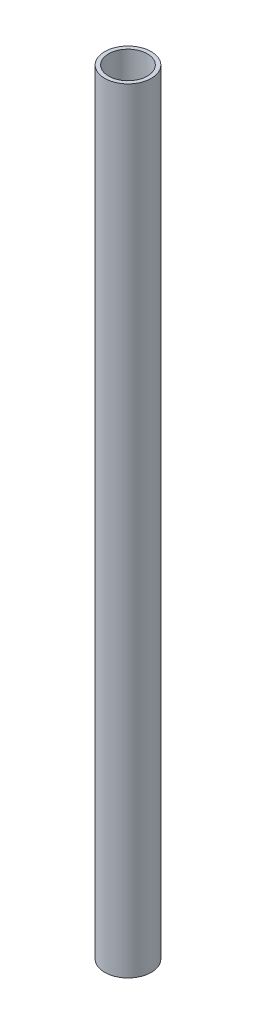
ISO-10303-21;
HEADER;
FILE_DESCRIPTION(('STEP AP214'),'2;1');
FILE_NAME('part.step','',(''),(''),'','','');
FILE_SCHEMA(('AUTOMOTIVE_DESIGN { 1 0 10303 214 1 1 1 1 }'));
ENDSEC;
DATA;
#1=APPLICATION_CONTEXT('core data for automotive mechanical design processes');
#2=APPLICATION_PROTOCOL_DEFINITION('international standard','automotive_design',2000,#1);
#3=PRODUCT_CONTEXT('',#1,'mechanical');
#4=PRODUCT('Part','Part','',(#3));
#5=PRODUCT_RELATED_PRODUCT_CATEGORY('part','',(#4));
#6=PRODUCT_DEFINITION_FORMATION('','',#4);
#7=PRODUCT_DEFINITION_CONTEXT('part definition',#1,'design');
#8=PRODUCT_DEFINITION('design','',#6,#7);
#9=PRODUCT_DEFINITION_SHAPE('','',#8);
#10=(LENGTH_UNIT() NAMED_UNIT(*) SI_UNIT(.MILLI.,.METRE.));
#11=(NAMED_UNIT(*) PLANE_ANGLE_UNIT() SI_UNIT($,.RADIAN.));
#12=(NAMED_UNIT(*) SI_UNIT($,.STERADIAN.) SOLID_ANGLE_UNIT());
#13=UNCERTAINTY_MEASURE_WITH_UNIT(LENGTH_MEASURE(1.E-05),#10,'distance_accuracy_value','');
#14=(GEOMETRIC_REPRESENTATION_CONTEXT(3) GLOBAL_UNCERTAINTY_ASSIGNED_CONTEXT((#13)) GLOBAL_UNIT_ASSIGNED_CONTEXT((#10,
#11,#12)) REPRESENTATION_CONTEXT('',''));
#15=CARTESIAN_POINT('',(0.,0.,0.));
#16=DIRECTION('',(0.,0.,1.));
#17=DIRECTION('',(1.,0.,0.));
#18=AXIS2_PLACEMENT_3D('',#15,#16,#17);
#19=CARTESIAN_POINT('',(0.,200.,0.));
#20=DIRECTION('',(0.,1.,0.));
#21=DIRECTION('',(0.,0.,1.));
#22=AXIS2_PLACEMENT_3D('',#19,#20,#21);
#23=PLANE('',#22);
#24=CARTESIAN_POINT('',(0.,200.,0.));
#25=DIRECTION('',(0.,1.,0.));
#26=DIRECTION('',(0.,0.,1.));
#27=AXIS2_PLACEMENT_3D('',#24,#25,#26);
#28=CIRCLE('',#27,6.);
#29=CARTESIAN_POINT('',(0.,200.,6.));
#30=VERTEX_POINT('',#29);
#31=EDGE_CURVE('E10',#30,#30,#28,.T.);
#32=ORIENTED_EDGE('',*,*,#31,.T.);
#33=EDGE_LOOP('',(#32));
#34=FACE_BOUND('',#33,.T.);
#35=CARTESIAN_POINT('',(0.,200.,0.));
#36=DIRECTION('',(0.,1.,0.));
#37=DIRECTION('',(0.,0.,1.));
#38=AXIS2_PLACEMENT_3D('',#35,#36,#37);
#39=CIRCLE('',#38,5.);
#40=CARTESIAN_POINT('',(0.,200.,5.));
#41=VERTEX_POINT('',#40);
#42=EDGE_CURVE('E43',#41,#41,#39,.T.);
#43=ORIENTED_EDGE('',*,*,#42,.F.);
#44=EDGE_LOOP('',(#43));
#45=FACE_BOUND('',#44,.T.);
#46=ADVANCED_FACE('F32',(#34,#45),#23,.T.);
#47=CARTESIAN_POINT('',(0.,0.,0.));
#48=DIRECTION('',(0.,1.,0.));
#49=DIRECTION('',(0.,0.,1.));
#50=AXIS2_PLACEMENT_3D('',#47,#48,#49);
#51=PLANE('',#50);
#52=CARTESIAN_POINT('',(0.,0.,0.));
#53=DIRECTION('',(0.,1.,0.));
#54=DIRECTION('',(0.,0.,1.));
#55=AXIS2_PLACEMENT_3D('',#52,#53,#54);
#56=CIRCLE('',#55,6.);
#57=CARTESIAN_POINT('',(0.,0.,6.));
#58=VERTEX_POINT('',#57);
#59=EDGE_CURVE('E36',#58,#58,#56,.T.);
#60=ORIENTED_EDGE('',*,*,#59,.F.);
#61=EDGE_LOOP('',(#60));
#62=FACE_BOUND('',#61,.T.);
#63=CARTESIAN_POINT('',(0.,0.,0.));
#64=DIRECTION('',(0.,1.,0.));
#65=DIRECTION('',(0.,0.,1.));
#66=AXIS2_PLACEMENT_3D('',#63,#64,#65);
#67=CIRCLE('',#66,5.);
#68=CARTESIAN_POINT('',(0.,0.,5.));
#69=VERTEX_POINT('',#68);
#70=EDGE_CURVE('E45',#69,#69,#67,.T.);
#71=ORIENTED_EDGE('',*,*,#70,.T.);
#72=EDGE_LOOP('',(#71));
#73=FACE_BOUND('',#72,.T.);
#74=ADVANCED_FACE('F55',(#62,#73),#51,.F.);
#75=CARTESIAN_POINT('',(0.,200.,0.));
#76=DIRECTION('',(0.,-1.,0.));
#77=DIRECTION('',(0.,0.,-1.));
#78=AXIS2_PLACEMENT_3D('',#75,#76,#77);
#79=CYLINDRICAL_SURFACE('',#78,6.);
#80=ORIENTED_EDGE('',*,*,#31,.F.);
#81=EDGE_LOOP('',(#80));
#82=FACE_BOUND('',#81,.T.);
#83=ORIENTED_EDGE('',*,*,#59,.T.);
#84=EDGE_LOOP('',(#83));
#85=FACE_BOUND('',#84,.T.);
#86=ADVANCED_FACE('F34',(#82,#85),#79,.T.);
#87=CARTESIAN_POINT('',(0.,200.,0.));
#88=DIRECTION('',(0.,-1.,0.));
#89=DIRECTION('',(0.,0.,-1.));
#90=AXIS2_PLACEMENT_3D('',#87,#88,#89);
#91=CYLINDRICAL_SURFACE('',#90,5.);
#92=ORIENTED_EDGE('',*,*,#42,.T.);
#93=EDGE_LOOP('',(#92));
#94=FACE_BOUND('',#93,.T.);
#95=ORIENTED_EDGE('',*,*,#70,.F.);
#96=EDGE_LOOP('',(#95));
#97=FACE_BOUND('',#96,.T.);
#98=ADVANCED_FACE('F51',(#94,#97),#91,.F.);
#99=CLOSED_SHELL('',(#46,#74,#86,#98));
#100=MANIFOLD_SOLID_BREP('B2',#99);
#101=ADVANCED_BREP_SHAPE_REPRESENTATION('',(#18,#100),#14);
#102=SHAPE_DEFINITION_REPRESENTATION(#9,#101);
ENDSEC;
END-ISO-10303-21;
